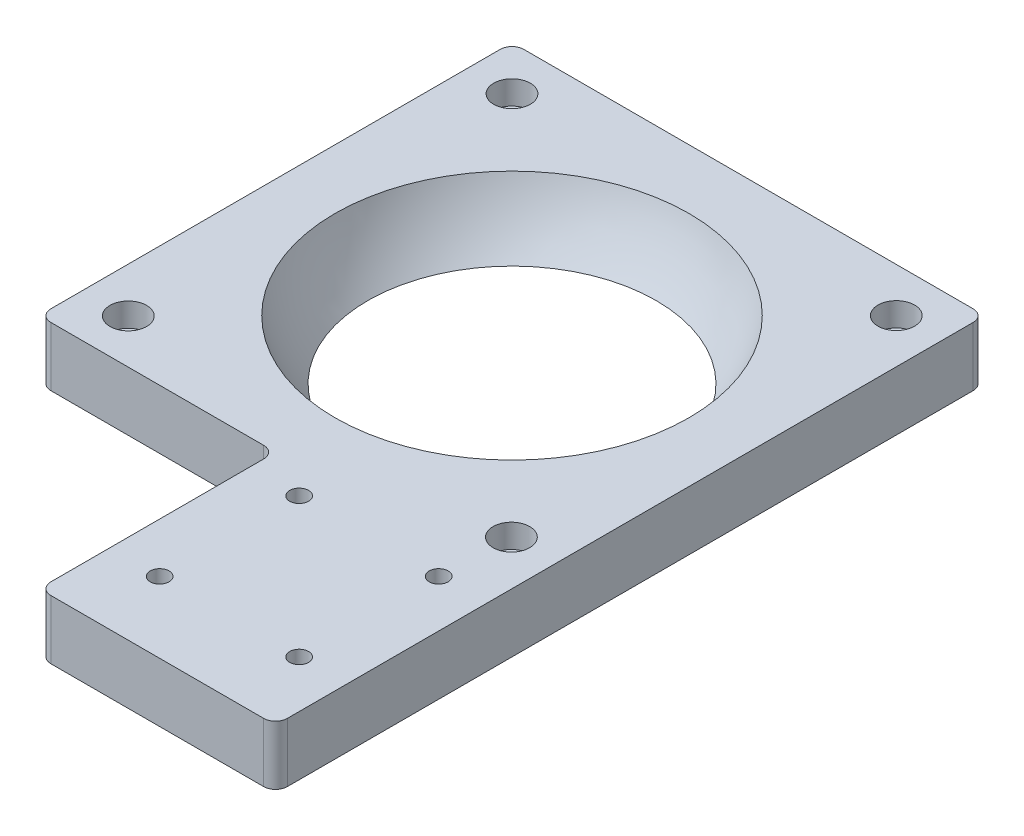
ISO-10303-21;
HEADER;
FILE_DESCRIPTION(('STEP AP214'),'2;1');
FILE_NAME('part.step','',(''),(''),'','','');
FILE_SCHEMA(('AUTOMOTIVE_DESIGN { 1 0 10303 214 1 1 1 1 }'));
ENDSEC;
DATA;
#1=APPLICATION_CONTEXT('core data for automotive mechanical design processes');
#2=APPLICATION_PROTOCOL_DEFINITION('international standard','automotive_design',2000,#1);
#3=PRODUCT_CONTEXT('',#1,'mechanical');
#4=PRODUCT('Part','Part','',(#3));
#5=PRODUCT_RELATED_PRODUCT_CATEGORY('part','',(#4));
#6=PRODUCT_DEFINITION_FORMATION('','',#4);
#7=PRODUCT_DEFINITION_CONTEXT('part definition',#1,'design');
#8=PRODUCT_DEFINITION('design','',#6,#7);
#9=PRODUCT_DEFINITION_SHAPE('','',#8);
#10=(LENGTH_UNIT() NAMED_UNIT(*) SI_UNIT(.MILLI.,.METRE.));
#11=(NAMED_UNIT(*) PLANE_ANGLE_UNIT() SI_UNIT($,.RADIAN.));
#12=(NAMED_UNIT(*) SI_UNIT($,.STERADIAN.) SOLID_ANGLE_UNIT());
#13=UNCERTAINTY_MEASURE_WITH_UNIT(LENGTH_MEASURE(1.E-05),#10,'distance_accuracy_value','');
#14=(GEOMETRIC_REPRESENTATION_CONTEXT(3) GLOBAL_UNCERTAINTY_ASSIGNED_CONTEXT((#13)) GLOBAL_UNIT_ASSIGNED_CONTEXT((#10,
#11,#12)) REPRESENTATION_CONTEXT('',''));
#15=CARTESIAN_POINT('',(0.,0.,0.));
#16=DIRECTION('',(0.,0.,1.));
#17=DIRECTION('',(1.,0.,0.));
#18=AXIS2_PLACEMENT_3D('',#15,#16,#17);
#19=CARTESIAN_POINT('',(41.275,0.,-41.275));
#20=DIRECTION('',(0.,1.,0.));
#21=DIRECTION('',(0.,0.,1.));
#22=AXIS2_PLACEMENT_3D('',#19,#20,#21);
#23=CYLINDRICAL_SURFACE('',#22,2.54);
#24=CARTESIAN_POINT('',(41.275,0.,-41.275));
#25=DIRECTION('',(0.,1.,0.));
#26=DIRECTION('',(0.,0.,1.));
#27=AXIS2_PLACEMENT_3D('',#24,#25,#26);
#28=CIRCLE('',#27,2.54);
#29=CARTESIAN_POINT('',(41.275,0.,-38.735));
#30=VERTEX_POINT('',#29);
#31=EDGE_CURVE('E307',#30,#30,#28,.T.);
#32=ORIENTED_EDGE('',*,*,#31,.F.);
#33=EDGE_LOOP('',(#32));
#34=FACE_BOUND('',#33,.T.);
#35=CARTESIAN_POINT('',(41.275,7.62,-41.275));
#36=DIRECTION('',(0.,1.,0.));
#37=DIRECTION('',(0.,0.,1.));
#38=AXIS2_PLACEMENT_3D('',#35,#36,#37);
#39=CIRCLE('',#38,2.54);
#40=CARTESIAN_POINT('',(41.275,7.62,-38.735));
#41=VERTEX_POINT('',#40);
#42=EDGE_CURVE('E310',#41,#41,#39,.F.);
#43=ORIENTED_EDGE('',*,*,#42,.F.);
#44=EDGE_LOOP('',(#43));
#45=FACE_BOUND('',#44,.T.);
#46=ADVANCED_FACE('F57',(#34,#45),#23,.F.);
#47=CARTESIAN_POINT('',(-41.275,0.,-41.275));
#48=DIRECTION('',(0.,1.,0.));
#49=DIRECTION('',(0.,0.,1.));
#50=AXIS2_PLACEMENT_3D('',#47,#48,#49);
#51=CYLINDRICAL_SURFACE('',#50,2.54);
#52=CARTESIAN_POINT('',(-41.275,0.,-41.275));
#53=DIRECTION('',(0.,1.,0.));
#54=DIRECTION('',(0.,0.,1.));
#55=AXIS2_PLACEMENT_3D('',#52,#53,#54);
#56=CIRCLE('',#55,2.54);
#57=CARTESIAN_POINT('',(-41.275,0.,-38.735));
#58=VERTEX_POINT('',#57);
#59=EDGE_CURVE('E303',#58,#58,#56,.T.);
#60=ORIENTED_EDGE('',*,*,#59,.F.);
#61=EDGE_LOOP('',(#60));
#62=FACE_BOUND('',#61,.T.);
#63=CARTESIAN_POINT('',(-41.275,7.62,-41.275));
#64=DIRECTION('',(0.,1.,0.));
#65=DIRECTION('',(0.,0.,1.));
#66=AXIS2_PLACEMENT_3D('',#63,#64,#65);
#67=CIRCLE('',#66,2.54);
#68=CARTESIAN_POINT('',(-41.275,7.62,-38.735));
#69=VERTEX_POINT('',#68);
#70=EDGE_CURVE('E294',#69,#69,#67,.F.);
#71=ORIENTED_EDGE('',*,*,#70,.F.);
#72=EDGE_LOOP('',(#71));
#73=FACE_BOUND('',#72,.T.);
#74=ADVANCED_FACE('F351',(#62,#73),#51,.F.);
#75=CARTESIAN_POINT('',(50.8,12.7,50.8));
#76=DIRECTION('',(-1.,0.,0.));
#77=DIRECTION('',(0.,0.,1.));
#78=AXIS2_PLACEMENT_3D('',#75,#76,#77);
#79=PLANE('',#78);
#80=DIRECTION('',(0.,0.,-1.));
#81=VECTOR('',#80,1.);
#82=CARTESIAN_POINT('',(50.8,12.7,50.8));
#83=LINE('',#82,#81);
#84=CARTESIAN_POINT('',(50.8,12.7,99.06));
#85=VERTEX_POINT('',#84);
#86=CARTESIAN_POINT('',(50.8,12.7,-48.26));
#87=VERTEX_POINT('',#86);
#88=EDGE_CURVE('E315',#85,#87,#83,.T.);
#89=ORIENTED_EDGE('',*,*,#88,.F.);
#90=DIRECTION('',(0.,1.,0.));
#91=VECTOR('',#90,1.);
#92=CARTESIAN_POINT('',(50.8,12.7,99.06));
#93=LINE('',#92,#91);
#94=CARTESIAN_POINT('',(50.8,0.,99.06));
#95=VERTEX_POINT('',#94);
#96=EDGE_CURVE('E156',#85,#95,#93,.F.);
#97=ORIENTED_EDGE('',*,*,#96,.T.);
#98=DIRECTION('',(0.,0.,-1.));
#99=VECTOR('',#98,1.);
#100=CARTESIAN_POINT('',(50.8,0.,50.8));
#101=LINE('',#100,#99);
#102=CARTESIAN_POINT('',(50.8,0.,-48.26));
#103=VERTEX_POINT('',#102);
#104=EDGE_CURVE('E148',#95,#103,#101,.T.);
#105=ORIENTED_EDGE('',*,*,#104,.T.);
#106=DIRECTION('',(0.,-1.,0.));
#107=VECTOR('',#106,1.);
#108=CARTESIAN_POINT('',(50.8,12.7,-48.26));
#109=LINE('',#108,#107);
#110=EDGE_CURVE('E153',#103,#87,#109,.F.);
#111=ORIENTED_EDGE('',*,*,#110,.T.);
#112=EDGE_LOOP('',(#89,#97,#105,#111));
#113=FACE_BOUND('',#112,.T.);
#114=ADVANCED_FACE('F151',(#113),#79,.F.);
#115=CARTESIAN_POINT('',(-50.8,12.7,-50.8));
#116=DIRECTION('',(0.,0.,1.));
#117=DIRECTION('',(1.,0.,0.));
#118=AXIS2_PLACEMENT_3D('',#115,#116,#117);
#119=PLANE('',#118);
#120=DIRECTION('',(-1.,0.,0.));
#121=VECTOR('',#120,1.);
#122=CARTESIAN_POINT('',(-50.8,12.7,-50.8));
#123=LINE('',#122,#121);
#124=CARTESIAN_POINT('',(48.26,12.7,-50.8));
#125=VERTEX_POINT('',#124);
#126=CARTESIAN_POINT('',(-48.26,12.7,-50.8));
#127=VERTEX_POINT('',#126);
#128=EDGE_CURVE('E317',#125,#127,#123,.T.);
#129=ORIENTED_EDGE('',*,*,#128,.F.);
#130=DIRECTION('',(0.,-1.,0.));
#131=VECTOR('',#130,1.);
#132=CARTESIAN_POINT('',(48.26,12.7,-50.8));
#133=LINE('',#132,#131);
#134=CARTESIAN_POINT('',(48.26,0.,-50.8));
#135=VERTEX_POINT('',#134);
#136=EDGE_CURVE('E177',#125,#135,#133,.T.);
#137=ORIENTED_EDGE('',*,*,#136,.T.);
#138=DIRECTION('',(-1.,0.,0.));
#139=VECTOR('',#138,1.);
#140=CARTESIAN_POINT('',(-50.8,0.,-50.8));
#141=LINE('',#140,#139);
#142=CARTESIAN_POINT('',(-48.26,0.,-50.8));
#143=VERTEX_POINT('',#142);
#144=EDGE_CURVE('E158',#135,#143,#141,.T.);
#145=ORIENTED_EDGE('',*,*,#144,.T.);
#146=DIRECTION('',(0.,-1.,0.));
#147=VECTOR('',#146,1.);
#148=CARTESIAN_POINT('',(-48.26,12.7,-50.8));
#149=LINE('',#148,#147);
#150=EDGE_CURVE('E175',#143,#127,#149,.F.);
#151=ORIENTED_EDGE('',*,*,#150,.T.);
#152=EDGE_LOOP('',(#129,#137,#145,#151));
#153=FACE_BOUND('',#152,.T.);
#154=ADVANCED_FACE('F343',(#153),#119,.F.);
#155=CARTESIAN_POINT('',(-50.8,12.7,50.8));
#156=DIRECTION('',(1.,0.,0.));
#157=DIRECTION('',(0.,0.,-1.));
#158=AXIS2_PLACEMENT_3D('',#155,#156,#157);
#159=PLANE('',#158);
#160=DIRECTION('',(0.,0.,1.));
#161=VECTOR('',#160,1.);
#162=CARTESIAN_POINT('',(-50.8,0.,50.8));
#163=LINE('',#162,#161);
#164=CARTESIAN_POINT('',(-50.8,0.,-48.26));
#165=VERTEX_POINT('',#164);
#166=CARTESIAN_POINT('',(-50.8,0.,48.26));
#167=VERTEX_POINT('',#166);
#168=EDGE_CURVE('E318',#165,#167,#163,.T.);
#169=ORIENTED_EDGE('',*,*,#168,.T.);
#170=DIRECTION('',(0.,1.,0.));
#171=VECTOR('',#170,1.);
#172=CARTESIAN_POINT('',(-50.8,12.7,48.26));
#173=LINE('',#172,#171);
#174=CARTESIAN_POINT('',(-50.8,12.7,48.26));
#175=VERTEX_POINT('',#174);
#176=EDGE_CURVE('E214',#167,#175,#173,.T.);
#177=ORIENTED_EDGE('',*,*,#176,.T.);
#178=DIRECTION('',(0.,0.,1.));
#179=VECTOR('',#178,1.);
#180=CARTESIAN_POINT('',(-50.8,12.7,50.8));
#181=LINE('',#180,#179);
#182=CARTESIAN_POINT('',(-50.8,12.7,-48.26));
#183=VERTEX_POINT('',#182);
#184=EDGE_CURVE('E321',#183,#175,#181,.T.);
#185=ORIENTED_EDGE('',*,*,#184,.F.);
#186=DIRECTION('',(0.,-1.,0.));
#187=VECTOR('',#186,1.);
#188=CARTESIAN_POINT('',(-50.8,12.7,-48.26));
#189=LINE('',#188,#187);
#190=EDGE_CURVE('E170',#183,#165,#189,.T.);
#191=ORIENTED_EDGE('',*,*,#190,.T.);
#192=EDGE_LOOP('',(#169,#177,#185,#191));
#193=FACE_BOUND('',#192,.T.);
#194=ADVANCED_FACE('F339',(#193),#159,.F.);
#195=CARTESIAN_POINT('',(0.,12.7,0.));
#196=DIRECTION('',(0.,-1.,0.));
#197=DIRECTION('',(0.,0.,-1.));
#198=AXIS2_PLACEMENT_3D('',#195,#196,#197);
#199=PLANE('',#198);
#200=CARTESIAN_POINT('',(40.64,12.7,56.388));
#201=DIRECTION('',(0.,1.,0.));
#202=DIRECTION('',(0.,0.,1.));
#203=AXIS2_PLACEMENT_3D('',#200,#201,#202);
#204=CIRCLE('',#203,2.032);
#205=CARTESIAN_POINT('',(40.64,12.7,58.42));
#206=VERTEX_POINT('',#205);
#207=EDGE_CURVE('E241',#206,#206,#204,.T.);
#208=ORIENTED_EDGE('',*,*,#207,.F.);
#209=EDGE_LOOP('',(#208));
#210=FACE_BOUND('',#209,.T.);
#211=CARTESIAN_POINT('',(40.64,12.7,86.36));
#212=DIRECTION('',(0.,1.,0.));
#213=DIRECTION('',(0.,0.,1.));
#214=AXIS2_PLACEMENT_3D('',#211,#212,#213);
#215=CIRCLE('',#214,2.032);
#216=CARTESIAN_POINT('',(40.64,12.7,88.392));
#217=VERTEX_POINT('',#216);
#218=EDGE_CURVE('E259',#217,#217,#215,.T.);
#219=ORIENTED_EDGE('',*,*,#218,.F.);
#220=EDGE_LOOP('',(#219));
#221=FACE_BOUND('',#220,.T.);
#222=CARTESIAN_POINT('',(10.668,12.7,86.36));
#223=DIRECTION('',(0.,1.,0.));
#224=DIRECTION('',(0.,0.,1.));
#225=AXIS2_PLACEMENT_3D('',#222,#223,#224);
#226=CIRCLE('',#225,2.032);
#227=CARTESIAN_POINT('',(10.668,12.7,88.392));
#228=VERTEX_POINT('',#227);
#229=EDGE_CURVE('E253',#228,#228,#226,.T.);
#230=ORIENTED_EDGE('',*,*,#229,.F.);
#231=EDGE_LOOP('',(#230));
#232=FACE_BOUND('',#231,.T.);
#233=CARTESIAN_POINT('',(10.668,12.7,56.388));
#234=DIRECTION('',(0.,1.,0.));
#235=DIRECTION('',(0.,0.,1.));
#236=AXIS2_PLACEMENT_3D('',#233,#234,#235);
#237=CIRCLE('',#236,2.032);
#238=CARTESIAN_POINT('',(10.668,12.7,58.42));
#239=VERTEX_POINT('',#238);
#240=EDGE_CURVE('E252',#239,#239,#237,.T.);
#241=ORIENTED_EDGE('',*,*,#240,.F.);
#242=EDGE_LOOP('',(#241));
#243=FACE_BOUND('',#242,.T.);
#244=CARTESIAN_POINT('',(-41.148,12.7,41.275));
#245=DIRECTION('',(0.,1.,0.));
#246=DIRECTION('',(0.,0.,1.));
#247=AXIS2_PLACEMENT_3D('',#244,#245,#246);
#248=CIRCLE('',#247,3.93699999999999);
#249=CARTESIAN_POINT('',(-41.148,12.7,45.212));
#250=VERTEX_POINT('',#249);
#251=EDGE_CURVE('E278',#250,#250,#248,.T.);
#252=ORIENTED_EDGE('',*,*,#251,.F.);
#253=EDGE_LOOP('',(#252));
#254=FACE_BOUND('',#253,.T.);
#255=CARTESIAN_POINT('',(41.148,12.7,41.275));
#256=DIRECTION('',(0.,1.,0.));
#257=DIRECTION('',(0.,0.,1.));
#258=AXIS2_PLACEMENT_3D('',#255,#256,#257);
#259=CIRCLE('',#258,3.93699999999999);
#260=CARTESIAN_POINT('',(41.148,12.7,45.212));
#261=VERTEX_POINT('',#260);
#262=EDGE_CURVE('E192',#261,#261,#259,.T.);
#263=ORIENTED_EDGE('',*,*,#262,.F.);
#264=EDGE_LOOP('',(#263));
#265=FACE_BOUND('',#264,.T.);
#266=DIRECTION('',(0.,0.,-1.));
#267=VECTOR('',#266,1.);
#268=CARTESIAN_POINT('',(0.,12.7,101.6));
#269=LINE('',#268,#267);
#270=CARTESIAN_POINT('',(0.,12.7,99.06));
#271=VERTEX_POINT('',#270);
#272=CARTESIAN_POINT('',(0.,12.7,53.34));
#273=VERTEX_POINT('',#272);
#274=EDGE_CURVE('E226',#271,#273,#269,.T.);
#275=ORIENTED_EDGE('',*,*,#274,.F.);
#276=CARTESIAN_POINT('',(2.54,12.7,99.06));
#277=DIRECTION('',(0.,-1.,0.));
#278=DIRECTION('',(0.,0.,-1.));
#279=AXIS2_PLACEMENT_3D('',#276,#277,#278);
#280=CIRCLE('',#279,2.54);
#281=CARTESIAN_POINT('',(2.54,12.7,101.6));
#282=VERTEX_POINT('',#281);
#283=EDGE_CURVE('E207',#271,#282,#280,.F.);
#284=ORIENTED_EDGE('',*,*,#283,.T.);
#285=DIRECTION('',(-1.,0.,0.));
#286=VECTOR('',#285,1.);
#287=CARTESIAN_POINT('',(0.,12.7,101.6));
#288=LINE('',#287,#286);
#289=CARTESIAN_POINT('',(48.26,12.7,101.6));
#290=VERTEX_POINT('',#289);
#291=EDGE_CURVE('E277',#290,#282,#288,.T.);
#292=ORIENTED_EDGE('',*,*,#291,.F.);
#293=CARTESIAN_POINT('',(48.26,12.7,99.06));
#294=DIRECTION('',(0.,-1.,0.));
#295=DIRECTION('',(0.,0.,-1.));
#296=AXIS2_PLACEMENT_3D('',#293,#294,#295);
#297=CIRCLE('',#296,2.54);
#298=EDGE_CURVE('E184',#290,#85,#297,.F.);
#299=ORIENTED_EDGE('',*,*,#298,.T.);
#300=ORIENTED_EDGE('',*,*,#88,.T.);
#301=CARTESIAN_POINT('',(48.26,12.7,-48.26));
#302=DIRECTION('',(0.,-1.,0.));
#303=DIRECTION('',(0.,0.,-1.));
#304=AXIS2_PLACEMENT_3D('',#301,#302,#303);
#305=CIRCLE('',#304,2.54);
#306=EDGE_CURVE('E174',#87,#125,#305,.F.);
#307=ORIENTED_EDGE('',*,*,#306,.T.);
#308=ORIENTED_EDGE('',*,*,#128,.T.);
#309=CARTESIAN_POINT('',(-48.26,12.7,-48.26));
#310=DIRECTION('',(0.,-1.,0.));
#311=DIRECTION('',(0.,0.,-1.));
#312=AXIS2_PLACEMENT_3D('',#309,#310,#311);
#313=CIRCLE('',#312,2.54);
#314=EDGE_CURVE('E179',#127,#183,#313,.F.);
#315=ORIENTED_EDGE('',*,*,#314,.T.);
#316=ORIENTED_EDGE('',*,*,#184,.T.);
#317=CARTESIAN_POINT('',(-48.26,12.7,48.26));
#318=DIRECTION('',(0.,-1.,0.));
#319=DIRECTION('',(0.,0.,-1.));
#320=AXIS2_PLACEMENT_3D('',#317,#318,#319);
#321=CIRCLE('',#320,2.54);
#322=CARTESIAN_POINT('',(-48.26,12.7,50.8));
#323=VERTEX_POINT('',#322);
#324=EDGE_CURVE('E205',#175,#323,#321,.F.);
#325=ORIENTED_EDGE('',*,*,#324,.T.);
#326=DIRECTION('',(-1.,0.,0.));
#327=VECTOR('',#326,1.);
#328=CARTESIAN_POINT('',(0.,12.7,50.8));
#329=LINE('',#328,#327);
#330=CARTESIAN_POINT('',(-2.54,12.7,50.8));
#331=VERTEX_POINT('',#330);
#332=EDGE_CURVE('E227',#331,#323,#329,.T.);
#333=ORIENTED_EDGE('',*,*,#332,.F.);
#334=CARTESIAN_POINT('',(-2.54,12.7,53.34));
#335=DIRECTION('',(0.,-1.,0.));
#336=DIRECTION('',(0.,0.,-1.));
#337=AXIS2_PLACEMENT_3D('',#334,#335,#336);
#338=CIRCLE('',#337,2.54);
#339=EDGE_CURVE('E65',#331,#273,#338,.T.);
#340=ORIENTED_EDGE('',*,*,#339,.T.);
#341=EDGE_LOOP('',(#275,#284,#292,#299,#300,#307,#308,#315,#316,#325,#333,#340));
#342=FACE_BOUND('',#341,.T.);
#343=CARTESIAN_POINT('',(0.,12.7,0.));
#344=DIRECTION('',(0.,-1.,0.));
#345=DIRECTION('',(0.,0.,-1.));
#346=AXIS2_PLACEMENT_3D('',#343,#344,#345);
#347=CIRCLE('',#346,38.0178800326567);
#348=CARTESIAN_POINT('',(0.,12.7,-38.0178800326567));
#349=VERTEX_POINT('',#348);
#350=EDGE_CURVE('E159',#349,#349,#347,.T.);
#351=ORIENTED_EDGE('',*,*,#350,.T.);
#352=EDGE_LOOP('',(#351));
#353=FACE_BOUND('',#352,.T.);
#354=CARTESIAN_POINT('',(41.275,12.7,-41.275));
#355=DIRECTION('',(0.,1.,0.));
#356=DIRECTION('',(0.,0.,1.));
#357=AXIS2_PLACEMENT_3D('',#354,#355,#356);
#358=CIRCLE('',#357,3.93699999999999);
#359=CARTESIAN_POINT('',(41.275,12.7,-37.338));
#360=VERTEX_POINT('',#359);
#361=EDGE_CURVE('E290',#360,#360,#358,.T.);
#362=ORIENTED_EDGE('',*,*,#361,.F.);
#363=EDGE_LOOP('',(#362));
#364=FACE_BOUND('',#363,.T.);
#365=CARTESIAN_POINT('',(-41.275,12.7,-41.275));
#366=DIRECTION('',(0.,1.,0.));
#367=DIRECTION('',(0.,0.,1.));
#368=AXIS2_PLACEMENT_3D('',#365,#366,#367);
#369=CIRCLE('',#368,3.937);
#370=CARTESIAN_POINT('',(-41.275,12.7,-37.338));
#371=VERTEX_POINT('',#370);
#372=EDGE_CURVE('E295',#371,#371,#369,.T.);
#373=ORIENTED_EDGE('',*,*,#372,.F.);
#374=EDGE_LOOP('',(#373));
#375=FACE_BOUND('',#374,.T.);
#376=ADVANCED_FACE('F224',(#210,#221,#232,#243,#254,#265,#342,#353,#364,#375),#199,.F.);
#377=CARTESIAN_POINT('',(0.,0.,0.));
#378=DIRECTION('',(0.,-1.,0.));
#379=DIRECTION('',(0.,0.,-1.));
#380=AXIS2_PLACEMENT_3D('',#377,#378,#379);
#381=PLANE('',#380);
#382=DIRECTION('',(-1.,0.,0.));
#383=VECTOR('',#382,1.);
#384=CARTESIAN_POINT('',(0.,0.,101.6));
#385=LINE('',#384,#383);
#386=CARTESIAN_POINT('',(48.26,0.,101.6));
#387=VERTEX_POINT('',#386);
#388=CARTESIAN_POINT('',(2.54,0.,101.6));
#389=VERTEX_POINT('',#388);
#390=EDGE_CURVE('E288',#387,#389,#385,.T.);
#391=ORIENTED_EDGE('',*,*,#390,.T.);
#392=CARTESIAN_POINT('',(2.54,0.,99.06));
#393=DIRECTION('',(0.,-1.,0.));
#394=DIRECTION('',(0.,0.,-1.));
#395=AXIS2_PLACEMENT_3D('',#392,#393,#394);
#396=CIRCLE('',#395,2.54);
#397=CARTESIAN_POINT('',(0.,0.,99.06));
#398=VERTEX_POINT('',#397);
#399=EDGE_CURVE('E212',#389,#398,#396,.T.);
#400=ORIENTED_EDGE('',*,*,#399,.T.);
#401=DIRECTION('',(0.,0.,-1.));
#402=VECTOR('',#401,1.);
#403=CARTESIAN_POINT('',(0.,0.,101.6));
#404=LINE('',#403,#402);
#405=CARTESIAN_POINT('',(0.,0.,53.34));
#406=VERTEX_POINT('',#405);
#407=EDGE_CURVE('E239',#398,#406,#404,.T.);
#408=ORIENTED_EDGE('',*,*,#407,.T.);
#409=CARTESIAN_POINT('',(-2.54,0.,53.34));
#410=DIRECTION('',(0.,-1.,0.));
#411=DIRECTION('',(0.,0.,-1.));
#412=AXIS2_PLACEMENT_3D('',#409,#410,#411);
#413=CIRCLE('',#412,2.54);
#414=CARTESIAN_POINT('',(-2.54,0.,50.8));
#415=VERTEX_POINT('',#414);
#416=EDGE_CURVE('E12',#406,#415,#413,.F.);
#417=ORIENTED_EDGE('',*,*,#416,.T.);
#418=DIRECTION('',(-1.,0.,0.));
#419=VECTOR('',#418,1.);
#420=CARTESIAN_POINT('',(0.,0.,50.8));
#421=LINE('',#420,#419);
#422=CARTESIAN_POINT('',(-48.26,0.,50.8));
#423=VERTEX_POINT('',#422);
#424=EDGE_CURVE('E238',#415,#423,#421,.T.);
#425=ORIENTED_EDGE('',*,*,#424,.T.);
#426=CARTESIAN_POINT('',(-48.26,0.,48.26));
#427=DIRECTION('',(0.,-1.,0.));
#428=DIRECTION('',(0.,0.,-1.));
#429=AXIS2_PLACEMENT_3D('',#426,#427,#428);
#430=CIRCLE('',#429,2.54);
#431=EDGE_CURVE('E72',#423,#167,#430,.T.);
#432=ORIENTED_EDGE('',*,*,#431,.T.);
#433=ORIENTED_EDGE('',*,*,#168,.F.);
#434=CARTESIAN_POINT('',(-48.26,0.,-48.26));
#435=DIRECTION('',(0.,-1.,0.));
#436=DIRECTION('',(0.,0.,-1.));
#437=AXIS2_PLACEMENT_3D('',#434,#435,#436);
#438=CIRCLE('',#437,2.54);
#439=EDGE_CURVE('E171',#165,#143,#438,.T.);
#440=ORIENTED_EDGE('',*,*,#439,.T.);
#441=ORIENTED_EDGE('',*,*,#144,.F.);
#442=CARTESIAN_POINT('',(48.26,0.,-48.26));
#443=DIRECTION('',(0.,-1.,0.));
#444=DIRECTION('',(0.,0.,-1.));
#445=AXIS2_PLACEMENT_3D('',#442,#443,#444);
#446=CIRCLE('',#445,2.54);
#447=EDGE_CURVE('E162',#135,#103,#446,.T.);
#448=ORIENTED_EDGE('',*,*,#447,.T.);
#449=ORIENTED_EDGE('',*,*,#104,.F.);
#450=CARTESIAN_POINT('',(48.26,0.,99.06));
#451=DIRECTION('',(0.,-1.,0.));
#452=DIRECTION('',(0.,0.,-1.));
#453=AXIS2_PLACEMENT_3D('',#450,#451,#452);
#454=CIRCLE('',#453,2.54);
#455=EDGE_CURVE('E197',#95,#387,#454,.T.);
#456=ORIENTED_EDGE('',*,*,#455,.T.);
#457=EDGE_LOOP('',(#391,#400,#408,#417,#425,#432,#433,#440,#441,#448,#449,#456));
#458=FACE_BOUND('',#457,.T.);
#459=CARTESIAN_POINT('',(40.64,0.,56.388));
#460=DIRECTION('',(0.,1.,0.));
#461=DIRECTION('',(0.,0.,1.));
#462=AXIS2_PLACEMENT_3D('',#459,#460,#461);
#463=CIRCLE('',#462,2.032);
#464=CARTESIAN_POINT('',(40.64,0.,58.42));
#465=VERTEX_POINT('',#464);
#466=EDGE_CURVE('E244',#465,#465,#463,.T.);
#467=ORIENTED_EDGE('',*,*,#466,.T.);
#468=EDGE_LOOP('',(#467));
#469=FACE_BOUND('',#468,.T.);
#470=CARTESIAN_POINT('',(40.64,0.,86.36));
#471=DIRECTION('',(0.,1.,0.));
#472=DIRECTION('',(0.,0.,1.));
#473=AXIS2_PLACEMENT_3D('',#470,#471,#472);
#474=CIRCLE('',#473,2.032);
#475=CARTESIAN_POINT('',(40.64,0.,88.392));
#476=VERTEX_POINT('',#475);
#477=EDGE_CURVE('E256',#476,#476,#474,.T.);
#478=ORIENTED_EDGE('',*,*,#477,.T.);
#479=EDGE_LOOP('',(#478));
#480=FACE_BOUND('',#479,.T.);
#481=CARTESIAN_POINT('',(10.668,0.,86.36));
#482=DIRECTION('',(0.,1.,0.));
#483=DIRECTION('',(0.,0.,1.));
#484=AXIS2_PLACEMENT_3D('',#481,#482,#483);
#485=CIRCLE('',#484,2.032);
#486=CARTESIAN_POINT('',(10.668,0.,88.392));
#487=VERTEX_POINT('',#486);
#488=EDGE_CURVE('E249',#487,#487,#485,.T.);
#489=ORIENTED_EDGE('',*,*,#488,.T.);
#490=EDGE_LOOP('',(#489));
#491=FACE_BOUND('',#490,.T.);
#492=CARTESIAN_POINT('',(10.668,0.,56.388));
#493=DIRECTION('',(0.,1.,0.));
#494=DIRECTION('',(0.,0.,1.));
#495=AXIS2_PLACEMENT_3D('',#492,#493,#494);
#496=CIRCLE('',#495,2.032);
#497=CARTESIAN_POINT('',(10.668,0.,58.42));
#498=VERTEX_POINT('',#497);
#499=EDGE_CURVE('E264',#498,#498,#496,.T.);
#500=ORIENTED_EDGE('',*,*,#499,.T.);
#501=EDGE_LOOP('',(#500));
#502=FACE_BOUND('',#501,.T.);
#503=CARTESIAN_POINT('',(-41.148,0.,41.275));
#504=DIRECTION('',(0.,1.,0.));
#505=DIRECTION('',(0.,0.,1.));
#506=AXIS2_PLACEMENT_3D('',#503,#504,#505);
#507=CIRCLE('',#506,2.54);
#508=CARTESIAN_POINT('',(-41.148,0.,43.815));
#509=VERTEX_POINT('',#508);
#510=EDGE_CURVE('E189',#509,#509,#507,.T.);
#511=ORIENTED_EDGE('',*,*,#510,.T.);
#512=EDGE_LOOP('',(#511));
#513=FACE_BOUND('',#512,.T.);
#514=CARTESIAN_POINT('',(41.148,0.,41.275));
#515=DIRECTION('',(0.,1.,0.));
#516=DIRECTION('',(0.,0.,1.));
#517=AXIS2_PLACEMENT_3D('',#514,#515,#516);
#518=CIRCLE('',#517,2.54);
#519=CARTESIAN_POINT('',(41.148,0.,43.815));
#520=VERTEX_POINT('',#519);
#521=EDGE_CURVE('E267',#520,#520,#518,.T.);
#522=ORIENTED_EDGE('',*,*,#521,.T.);
#523=EDGE_LOOP('',(#522));
#524=FACE_BOUND('',#523,.T.);
#525=ORIENTED_EDGE('',*,*,#59,.T.);
#526=EDGE_LOOP('',(#525));
#527=FACE_BOUND('',#526,.T.);
#528=ORIENTED_EDGE('',*,*,#31,.T.);
#529=EDGE_LOOP('',(#528));
#530=FACE_BOUND('',#529,.T.);
#531=CARTESIAN_POINT('',(0.,0.,0.));
#532=DIRECTION('',(0.,-1.,0.));
#533=DIRECTION('',(0.,0.,-1.));
#534=AXIS2_PLACEMENT_3D('',#531,#532,#533);
#535=CIRCLE('',#534,30.988);
#536=CARTESIAN_POINT('',(0.,0.,-30.988));
#537=VERTEX_POINT('',#536);
#538=EDGE_CURVE('E306',#537,#537,#535,.T.);
#539=ORIENTED_EDGE('',*,*,#538,.F.);
#540=EDGE_LOOP('',(#539));
#541=FACE_BOUND('',#540,.T.);
#542=ADVANCED_FACE('F164',(#458,#469,#480,#491,#502,#513,#524,#527,#530,#541),#381,.T.);
#543=CARTESIAN_POINT('',(0.,27.587819719859,0.));
#544=DIRECTION('',(0.,-1.,0.));
#545=DIRECTION('',(0.,0.,-1.));
#546=AXIS2_PLACEMENT_3D('',#543,#544,#545);
#547=DEGENERATE_TOROIDAL_SURFACE('',#546,3.86475746773213,44.45,.F.);
#548=ORIENTED_EDGE('',*,*,#538,.T.);
#549=EDGE_LOOP('',(#548));
#550=FACE_BOUND('',#549,.T.);
#551=ORIENTED_EDGE('',*,*,#350,.F.);
#552=EDGE_LOOP('',(#551));
#553=FACE_BOUND('',#552,.T.);
#554=ADVANCED_FACE('F365',(#550,#553),#547,.T.);
#555=CARTESIAN_POINT('',(-41.275,7.62,-41.275));
#556=DIRECTION('',(0.,1.,0.));
#557=DIRECTION('',(0.,0.,1.));
#558=AXIS2_PLACEMENT_3D('',#555,#556,#557);
#559=PLANE('',#558);
#560=CARTESIAN_POINT('',(-41.275,7.62,-41.275));
#561=DIRECTION('',(0.,1.,0.));
#562=DIRECTION('',(0.,0.,1.));
#563=AXIS2_PLACEMENT_3D('',#560,#561,#562);
#564=CIRCLE('',#563,3.937);
#565=CARTESIAN_POINT('',(-41.275,7.62,-37.338));
#566=VERTEX_POINT('',#565);
#567=EDGE_CURVE('E291',#566,#566,#564,.T.);
#568=ORIENTED_EDGE('',*,*,#567,.T.);
#569=EDGE_LOOP('',(#568));
#570=FACE_BOUND('',#569,.T.);
#571=ORIENTED_EDGE('',*,*,#70,.T.);
#572=EDGE_LOOP('',(#571));
#573=FACE_BOUND('',#572,.T.);
#574=ADVANCED_FACE('F368',(#570,#573),#559,.T.);
#575=CARTESIAN_POINT('',(-41.275,7.62,-41.275));
#576=DIRECTION('',(0.,1.,0.));
#577=DIRECTION('',(0.,0.,1.));
#578=AXIS2_PLACEMENT_3D('',#575,#576,#577);
#579=CYLINDRICAL_SURFACE('',#578,3.937);
#580=ORIENTED_EDGE('',*,*,#567,.F.);
#581=EDGE_LOOP('',(#580));
#582=FACE_BOUND('',#581,.T.);
#583=ORIENTED_EDGE('',*,*,#372,.T.);
#584=EDGE_LOOP('',(#583));
#585=FACE_BOUND('',#584,.T.);
#586=ADVANCED_FACE('F389',(#582,#585),#579,.F.);
#587=CARTESIAN_POINT('',(41.275,7.62,-41.275));
#588=DIRECTION('',(0.,1.,0.));
#589=DIRECTION('',(0.,0.,1.));
#590=AXIS2_PLACEMENT_3D('',#587,#588,#589);
#591=PLANE('',#590);
#592=CARTESIAN_POINT('',(41.275,7.62,-41.275));
#593=DIRECTION('',(0.,1.,0.));
#594=DIRECTION('',(0.,0.,1.));
#595=AXIS2_PLACEMENT_3D('',#592,#593,#594);
#596=CIRCLE('',#595,3.93699999999999);
#597=CARTESIAN_POINT('',(41.275,7.62,-37.338));
#598=VERTEX_POINT('',#597);
#599=EDGE_CURVE('E298',#598,#598,#596,.T.);
#600=ORIENTED_EDGE('',*,*,#599,.T.);
#601=EDGE_LOOP('',(#600));
#602=FACE_BOUND('',#601,.T.);
#603=ORIENTED_EDGE('',*,*,#42,.T.);
#604=EDGE_LOOP('',(#603));
#605=FACE_BOUND('',#604,.T.);
#606=ADVANCED_FACE('F398',(#602,#605),#591,.T.);
#607=CARTESIAN_POINT('',(41.275,7.62,-41.275));
#608=DIRECTION('',(0.,1.,0.));
#609=DIRECTION('',(0.,0.,1.));
#610=AXIS2_PLACEMENT_3D('',#607,#608,#609);
#611=CYLINDRICAL_SURFACE('',#610,3.93699999999999);
#612=ORIENTED_EDGE('',*,*,#599,.F.);
#613=EDGE_LOOP('',(#612));
#614=FACE_BOUND('',#613,.T.);
#615=ORIENTED_EDGE('',*,*,#361,.T.);
#616=EDGE_LOOP('',(#615));
#617=FACE_BOUND('',#616,.T.);
#618=ADVANCED_FACE('F406',(#614,#617),#611,.F.);
#619=CARTESIAN_POINT('',(48.26,12.7,-48.26));
#620=DIRECTION('',(0.,-1.,0.));
#621=DIRECTION('',(0.,0.,-1.));
#622=AXIS2_PLACEMENT_3D('',#619,#620,#621);
#623=CYLINDRICAL_SURFACE('',#622,2.54);
#624=ORIENTED_EDGE('',*,*,#306,.F.);
#625=ORIENTED_EDGE('',*,*,#110,.F.);
#626=ORIENTED_EDGE('',*,*,#447,.F.);
#627=ORIENTED_EDGE('',*,*,#136,.F.);
#628=EDGE_LOOP('',(#624,#625,#626,#627));
#629=FACE_BOUND('',#628,.T.);
#630=ADVANCED_FACE('F173',(#629),#623,.T.);
#631=CARTESIAN_POINT('',(-48.26,12.7,-48.26));
#632=DIRECTION('',(0.,-1.,0.));
#633=DIRECTION('',(0.,0.,-1.));
#634=AXIS2_PLACEMENT_3D('',#631,#632,#633);
#635=CYLINDRICAL_SURFACE('',#634,2.54);
#636=ORIENTED_EDGE('',*,*,#314,.F.);
#637=ORIENTED_EDGE('',*,*,#150,.F.);
#638=ORIENTED_EDGE('',*,*,#439,.F.);
#639=ORIENTED_EDGE('',*,*,#190,.F.);
#640=EDGE_LOOP('',(#636,#637,#638,#639));
#641=FACE_BOUND('',#640,.T.);
#642=ADVANCED_FACE('F341',(#641),#635,.T.);
#643=CARTESIAN_POINT('',(0.,-114.750667100457,101.6));
#644=DIRECTION('',(0.,0.,-1.));
#645=DIRECTION('',(-1.,0.,0.));
#646=AXIS2_PLACEMENT_3D('',#643,#644,#645);
#647=PLANE('',#646);
#648=ORIENTED_EDGE('',*,*,#291,.T.);
#649=DIRECTION('',(0.,1.,0.));
#650=VECTOR('',#649,1.);
#651=CARTESIAN_POINT('',(2.54,-114.750667100457,101.6));
#652=LINE('',#651,#650);
#653=EDGE_CURVE('E209',#282,#389,#652,.F.);
#654=ORIENTED_EDGE('',*,*,#653,.T.);
#655=ORIENTED_EDGE('',*,*,#390,.F.);
#656=DIRECTION('',(0.,1.,0.));
#657=VECTOR('',#656,1.);
#658=CARTESIAN_POINT('',(48.26,-114.750667100457,101.6));
#659=LINE('',#658,#657);
#660=EDGE_CURVE('E194',#387,#290,#659,.T.);
#661=ORIENTED_EDGE('',*,*,#660,.T.);
#662=EDGE_LOOP('',(#648,#654,#655,#661));
#663=FACE_BOUND('',#662,.T.);
#664=ADVANCED_FACE('F426',(#663),#647,.F.);
#665=CARTESIAN_POINT('',(41.148,7.62,41.275));
#666=DIRECTION('',(0.,1.,0.));
#667=DIRECTION('',(0.,0.,1.));
#668=AXIS2_PLACEMENT_3D('',#665,#666,#667);
#669=CYLINDRICAL_SURFACE('',#668,3.93699999999999);
#670=CARTESIAN_POINT('',(41.148,7.62,41.275));
#671=DIRECTION('',(0.,1.,0.));
#672=DIRECTION('',(0.,0.,1.));
#673=AXIS2_PLACEMENT_3D('',#670,#671,#672);
#674=CIRCLE('',#673,3.93699999999999);
#675=CARTESIAN_POINT('',(41.148,7.62,45.212));
#676=VERTEX_POINT('',#675);
#677=EDGE_CURVE('E281',#676,#676,#674,.T.);
#678=ORIENTED_EDGE('',*,*,#677,.F.);
#679=EDGE_LOOP('',(#678));
#680=FACE_BOUND('',#679,.T.);
#681=ORIENTED_EDGE('',*,*,#262,.T.);
#682=EDGE_LOOP('',(#681));
#683=FACE_BOUND('',#682,.T.);
#684=ADVANCED_FACE('F433',(#680,#683),#669,.F.);
#685=CARTESIAN_POINT('',(41.148,7.62,41.275));
#686=DIRECTION('',(0.,1.,0.));
#687=DIRECTION('',(0.,0.,1.));
#688=AXIS2_PLACEMENT_3D('',#685,#686,#687);
#689=PLANE('',#688);
#690=CARTESIAN_POINT('',(41.148,7.62,41.275));
#691=DIRECTION('',(0.,1.,0.));
#692=DIRECTION('',(0.,0.,1.));
#693=AXIS2_PLACEMENT_3D('',#690,#691,#692);
#694=CIRCLE('',#693,2.54);
#695=CARTESIAN_POINT('',(41.148,7.62,43.815));
#696=VERTEX_POINT('',#695);
#697=EDGE_CURVE('E188',#696,#696,#694,.T.);
#698=ORIENTED_EDGE('',*,*,#697,.F.);
#699=EDGE_LOOP('',(#698));
#700=FACE_BOUND('',#699,.T.);
#701=ORIENTED_EDGE('',*,*,#677,.T.);
#702=EDGE_LOOP('',(#701));
#703=FACE_BOUND('',#702,.T.);
#704=ADVANCED_FACE('F441',(#700,#703),#689,.T.);
#705=CARTESIAN_POINT('',(-41.148,7.62,41.275));
#706=DIRECTION('',(0.,1.,0.));
#707=DIRECTION('',(0.,0.,1.));
#708=AXIS2_PLACEMENT_3D('',#705,#706,#707);
#709=CYLINDRICAL_SURFACE('',#708,3.93699999999999);
#710=CARTESIAN_POINT('',(-41.148,7.62,41.275));
#711=DIRECTION('',(0.,1.,0.));
#712=DIRECTION('',(0.,0.,1.));
#713=AXIS2_PLACEMENT_3D('',#710,#711,#712);
#714=CIRCLE('',#713,3.93699999999999);
#715=CARTESIAN_POINT('',(-41.148,7.62,45.212));
#716=VERTEX_POINT('',#715);
#717=EDGE_CURVE('E274',#716,#716,#714,.T.);
#718=ORIENTED_EDGE('',*,*,#717,.F.);
#719=EDGE_LOOP('',(#718));
#720=FACE_BOUND('',#719,.T.);
#721=ORIENTED_EDGE('',*,*,#251,.T.);
#722=EDGE_LOOP('',(#721));
#723=FACE_BOUND('',#722,.T.);
#724=ADVANCED_FACE('F450',(#720,#723),#709,.F.);
#725=CARTESIAN_POINT('',(-41.148,7.62,41.275));
#726=DIRECTION('',(0.,1.,0.));
#727=DIRECTION('',(0.,0.,1.));
#728=AXIS2_PLACEMENT_3D('',#725,#726,#727);
#729=PLANE('',#728);
#730=CARTESIAN_POINT('',(-41.148,7.62,41.275));
#731=DIRECTION('',(0.,1.,0.));
#732=DIRECTION('',(0.,0.,1.));
#733=AXIS2_PLACEMENT_3D('',#730,#731,#732);
#734=CIRCLE('',#733,2.54);
#735=CARTESIAN_POINT('',(-41.148,7.62,43.815));
#736=VERTEX_POINT('',#735);
#737=EDGE_CURVE('E185',#736,#736,#734,.T.);
#738=ORIENTED_EDGE('',*,*,#737,.F.);
#739=EDGE_LOOP('',(#738));
#740=FACE_BOUND('',#739,.T.);
#741=ORIENTED_EDGE('',*,*,#717,.T.);
#742=EDGE_LOOP('',(#741));
#743=FACE_BOUND('',#742,.T.);
#744=ADVANCED_FACE('F458',(#740,#743),#729,.T.);
#745=CARTESIAN_POINT('',(-41.148,0.,41.275));
#746=DIRECTION('',(0.,1.,0.));
#747=DIRECTION('',(0.,0.,1.));
#748=AXIS2_PLACEMENT_3D('',#745,#746,#747);
#749=CYLINDRICAL_SURFACE('',#748,2.54);
#750=ORIENTED_EDGE('',*,*,#737,.T.);
#751=EDGE_LOOP('',(#750));
#752=FACE_BOUND('',#751,.T.);
#753=ORIENTED_EDGE('',*,*,#510,.F.);
#754=EDGE_LOOP('',(#753));
#755=FACE_BOUND('',#754,.T.);
#756=ADVANCED_FACE('F465',(#752,#755),#749,.F.);
#757=CARTESIAN_POINT('',(41.148,0.,41.275));
#758=DIRECTION('',(0.,1.,0.));
#759=DIRECTION('',(0.,0.,1.));
#760=AXIS2_PLACEMENT_3D('',#757,#758,#759);
#761=CYLINDRICAL_SURFACE('',#760,2.54);
#762=ORIENTED_EDGE('',*,*,#697,.T.);
#763=EDGE_LOOP('',(#762));
#764=FACE_BOUND('',#763,.T.);
#765=ORIENTED_EDGE('',*,*,#521,.F.);
#766=EDGE_LOOP('',(#765));
#767=FACE_BOUND('',#766,.T.);
#768=ADVANCED_FACE('F473',(#764,#767),#761,.F.);
#769=CARTESIAN_POINT('',(48.26,-114.750667100457,99.06));
#770=DIRECTION('',(0.,1.,0.));
#771=DIRECTION('',(0.,0.,1.));
#772=AXIS2_PLACEMENT_3D('',#769,#770,#771);
#773=CYLINDRICAL_SURFACE('',#772,2.54);
#774=ORIENTED_EDGE('',*,*,#455,.F.);
#775=ORIENTED_EDGE('',*,*,#96,.F.);
#776=ORIENTED_EDGE('',*,*,#298,.F.);
#777=ORIENTED_EDGE('',*,*,#660,.F.);
#778=EDGE_LOOP('',(#774,#775,#776,#777));
#779=FACE_BOUND('',#778,.T.);
#780=ADVANCED_FACE('F481',(#779),#773,.T.);
#781=CARTESIAN_POINT('',(10.668,0.,56.388));
#782=DIRECTION('',(0.,1.,0.));
#783=DIRECTION('',(0.,0.,1.));
#784=AXIS2_PLACEMENT_3D('',#781,#782,#783);
#785=CYLINDRICAL_SURFACE('',#784,2.032);
#786=ORIENTED_EDGE('',*,*,#499,.F.);
#787=EDGE_LOOP('',(#786));
#788=FACE_BOUND('',#787,.T.);
#789=ORIENTED_EDGE('',*,*,#240,.T.);
#790=EDGE_LOOP('',(#789));
#791=FACE_BOUND('',#790,.T.);
#792=ADVANCED_FACE('F490',(#788,#791),#785,.F.);
#793=CARTESIAN_POINT('',(10.668,0.,86.36));
#794=DIRECTION('',(0.,1.,0.));
#795=DIRECTION('',(0.,0.,1.));
#796=AXIS2_PLACEMENT_3D('',#793,#794,#795);
#797=CYLINDRICAL_SURFACE('',#796,2.032);
#798=ORIENTED_EDGE('',*,*,#488,.F.);
#799=EDGE_LOOP('',(#798));
#800=FACE_BOUND('',#799,.T.);
#801=ORIENTED_EDGE('',*,*,#229,.T.);
#802=EDGE_LOOP('',(#801));
#803=FACE_BOUND('',#802,.T.);
#804=ADVANCED_FACE('F498',(#800,#803),#797,.F.);
#805=CARTESIAN_POINT('',(40.64,0.,86.36));
#806=DIRECTION('',(0.,1.,0.));
#807=DIRECTION('',(0.,0.,1.));
#808=AXIS2_PLACEMENT_3D('',#805,#806,#807);
#809=CYLINDRICAL_SURFACE('',#808,2.032);
#810=ORIENTED_EDGE('',*,*,#477,.F.);
#811=EDGE_LOOP('',(#810));
#812=FACE_BOUND('',#811,.T.);
#813=ORIENTED_EDGE('',*,*,#218,.T.);
#814=EDGE_LOOP('',(#813));
#815=FACE_BOUND('',#814,.T.);
#816=ADVANCED_FACE('F506',(#812,#815),#809,.F.);
#817=CARTESIAN_POINT('',(40.64,0.,56.388));
#818=DIRECTION('',(0.,1.,0.));
#819=DIRECTION('',(0.,0.,1.));
#820=AXIS2_PLACEMENT_3D('',#817,#818,#819);
#821=CYLINDRICAL_SURFACE('',#820,2.032);
#822=ORIENTED_EDGE('',*,*,#466,.F.);
#823=EDGE_LOOP('',(#822));
#824=FACE_BOUND('',#823,.T.);
#825=ORIENTED_EDGE('',*,*,#207,.T.);
#826=EDGE_LOOP('',(#825));
#827=FACE_BOUND('',#826,.T.);
#828=ADVANCED_FACE('F514',(#824,#827),#821,.F.);
#829=CARTESIAN_POINT('',(0.,0.,101.6));
#830=DIRECTION('',(1.,0.,0.));
#831=DIRECTION('',(0.,0.,-1.));
#832=AXIS2_PLACEMENT_3D('',#829,#830,#831);
#833=PLANE('',#832);
#834=ORIENTED_EDGE('',*,*,#407,.F.);
#835=DIRECTION('',(0.,1.,0.));
#836=VECTOR('',#835,1.);
#837=CARTESIAN_POINT('',(0.,0.,99.06));
#838=LINE('',#837,#836);
#839=EDGE_CURVE('E202',#398,#271,#838,.T.);
#840=ORIENTED_EDGE('',*,*,#839,.T.);
#841=ORIENTED_EDGE('',*,*,#274,.T.);
#842=DIRECTION('',(0.,1.,0.));
#843=VECTOR('',#842,1.);
#844=CARTESIAN_POINT('',(0.,0.,53.34));
#845=LINE('',#844,#843);
#846=EDGE_CURVE('E200',#273,#406,#845,.F.);
#847=ORIENTED_EDGE('',*,*,#846,.T.);
#848=EDGE_LOOP('',(#834,#840,#841,#847));
#849=FACE_BOUND('',#848,.T.);
#850=ADVANCED_FACE('F233',(#849),#833,.F.);
#851=CARTESIAN_POINT('',(0.,0.,50.8));
#852=DIRECTION('',(0.,0.,-1.));
#853=DIRECTION('',(-1.,0.,0.));
#854=AXIS2_PLACEMENT_3D('',#851,#852,#853);
#855=PLANE('',#854);
#856=ORIENTED_EDGE('',*,*,#332,.T.);
#857=DIRECTION('',(0.,1.,0.));
#858=VECTOR('',#857,1.);
#859=CARTESIAN_POINT('',(-48.26,0.,50.8));
#860=LINE('',#859,#858);
#861=EDGE_CURVE('E80',#323,#423,#860,.F.);
#862=ORIENTED_EDGE('',*,*,#861,.T.);
#863=ORIENTED_EDGE('',*,*,#424,.F.);
#864=DIRECTION('',(0.,1.,0.));
#865=VECTOR('',#864,1.);
#866=CARTESIAN_POINT('',(-2.54,12.7,50.8));
#867=LINE('',#866,#865);
#868=EDGE_CURVE('E217',#415,#331,#867,.T.);
#869=ORIENTED_EDGE('',*,*,#868,.T.);
#870=EDGE_LOOP('',(#856,#862,#863,#869));
#871=FACE_BOUND('',#870,.T.);
#872=ADVANCED_FACE('F240',(#871),#855,.F.);
#873=CARTESIAN_POINT('',(2.54,0.,99.06));
#874=DIRECTION('',(0.,1.,0.));
#875=DIRECTION('',(0.,0.,1.));
#876=AXIS2_PLACEMENT_3D('',#873,#874,#875);
#877=CYLINDRICAL_SURFACE('',#876,2.54);
#878=ORIENTED_EDGE('',*,*,#399,.F.);
#879=ORIENTED_EDGE('',*,*,#653,.F.);
#880=ORIENTED_EDGE('',*,*,#283,.F.);
#881=ORIENTED_EDGE('',*,*,#839,.F.);
#882=EDGE_LOOP('',(#878,#879,#880,#881));
#883=FACE_BOUND('',#882,.T.);
#884=ADVANCED_FACE('F535',(#883),#877,.T.);
#885=CARTESIAN_POINT('',(-48.26,12.7,48.26));
#886=DIRECTION('',(0.,1.,0.));
#887=DIRECTION('',(0.,0.,1.));
#888=AXIS2_PLACEMENT_3D('',#885,#886,#887);
#889=CYLINDRICAL_SURFACE('',#888,2.54);
#890=ORIENTED_EDGE('',*,*,#431,.F.);
#891=ORIENTED_EDGE('',*,*,#861,.F.);
#892=ORIENTED_EDGE('',*,*,#324,.F.);
#893=ORIENTED_EDGE('',*,*,#176,.F.);
#894=EDGE_LOOP('',(#890,#891,#892,#893));
#895=FACE_BOUND('',#894,.T.);
#896=ADVANCED_FACE('F542',(#895),#889,.T.);
#897=CARTESIAN_POINT('',(-2.54,0.,53.34));
#898=DIRECTION('',(0.,-1.,0.));
#899=DIRECTION('',(0.,0.,-1.));
#900=AXIS2_PLACEMENT_3D('',#897,#898,#899);
#901=CYLINDRICAL_SURFACE('',#900,2.54);
#902=ORIENTED_EDGE('',*,*,#416,.F.);
#903=ORIENTED_EDGE('',*,*,#846,.F.);
#904=ORIENTED_EDGE('',*,*,#339,.F.);
#905=ORIENTED_EDGE('',*,*,#868,.F.);
#906=EDGE_LOOP('',(#902,#903,#904,#905));
#907=FACE_BOUND('',#906,.T.);
#908=ADVANCED_FACE('F59',(#907),#901,.F.);
#909=CLOSED_SHELL('',(#46,#74,#114,#154,#194,#376,#542,#554,#574,#586,#606,#618,#630,#642,#664,
#684,#704,#724,#744,#756,#768,#780,#792,#804,#816,#828,#850,#872,#884,#896,#908));
#910=MANIFOLD_SOLID_BREP('B2',#909);
#911=ADVANCED_BREP_SHAPE_REPRESENTATION('',(#18,#910),#14);
#912=SHAPE_DEFINITION_REPRESENTATION(#9,#911);
ENDSEC;
END-ISO-10303-21;
